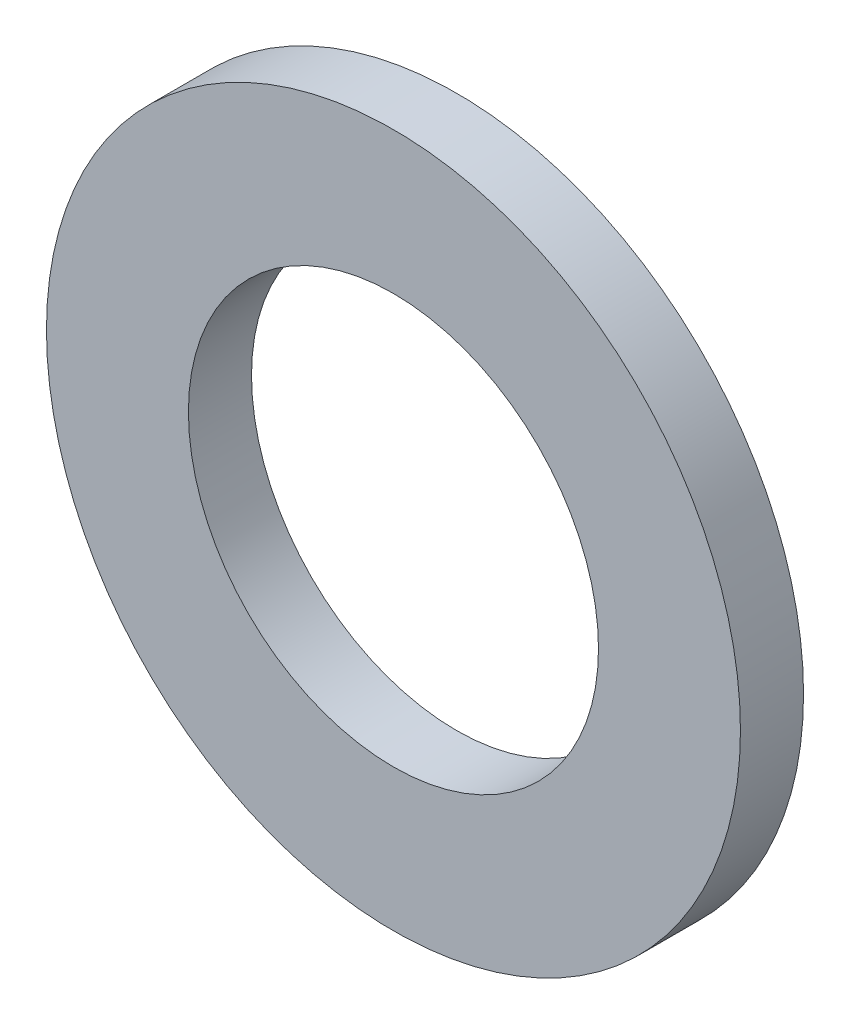
ISO-10303-21;
HEADER;
FILE_DESCRIPTION(('STEP AP214'),'2;1');
FILE_NAME('part.step','',(''),(''),'','','');
FILE_SCHEMA(('AUTOMOTIVE_DESIGN { 1 0 10303 214 1 1 1 1 }'));
ENDSEC;
DATA;
#1=APPLICATION_CONTEXT('core data for automotive mechanical design processes');
#2=APPLICATION_PROTOCOL_DEFINITION('international standard','automotive_design',2000,#1);
#3=PRODUCT_CONTEXT('',#1,'mechanical');
#4=PRODUCT('Part','Part','',(#3));
#5=PRODUCT_RELATED_PRODUCT_CATEGORY('part','',(#4));
#6=PRODUCT_DEFINITION_FORMATION('','',#4);
#7=PRODUCT_DEFINITION_CONTEXT('part definition',#1,'design');
#8=PRODUCT_DEFINITION('design','',#6,#7);
#9=PRODUCT_DEFINITION_SHAPE('','',#8);
#10=(LENGTH_UNIT() NAMED_UNIT(*) SI_UNIT(.MILLI.,.METRE.));
#11=(NAMED_UNIT(*) PLANE_ANGLE_UNIT() SI_UNIT($,.RADIAN.));
#12=(NAMED_UNIT(*) SI_UNIT($,.STERADIAN.) SOLID_ANGLE_UNIT());
#13=UNCERTAINTY_MEASURE_WITH_UNIT(LENGTH_MEASURE(1.E-05),#10,'distance_accuracy_value','');
#14=(GEOMETRIC_REPRESENTATION_CONTEXT(3) GLOBAL_UNCERTAINTY_ASSIGNED_CONTEXT((#13)) GLOBAL_UNIT_ASSIGNED_CONTEXT((#10,
#11,#12)) REPRESENTATION_CONTEXT('',''));
#15=CARTESIAN_POINT('',(0.,0.,0.));
#16=DIRECTION('',(0.,0.,1.));
#17=DIRECTION('',(1.,0.,0.));
#18=AXIS2_PLACEMENT_3D('',#15,#16,#17);
#19=CARTESIAN_POINT('',(0.,0.,4.));
#20=DIRECTION('',(0.,0.,-1.));
#21=DIRECTION('',(-1.,0.,0.));
#22=AXIS2_PLACEMENT_3D('',#19,#20,#21);
#23=CYLINDRICAL_SURFACE('',#22,13.);
#24=CARTESIAN_POINT('',(0.,0.,4.));
#25=DIRECTION('',(0.,0.,1.));
#26=DIRECTION('',(1.,0.,0.));
#27=AXIS2_PLACEMENT_3D('',#24,#25,#26);
#28=CIRCLE('',#27,13.);
#29=CARTESIAN_POINT('',(13.,0.,4.));
#30=VERTEX_POINT('',#29);
#31=EDGE_CURVE('E47',#30,#30,#28,.T.);
#32=ORIENTED_EDGE('',*,*,#31,.T.);
#33=EDGE_LOOP('',(#32));
#34=FACE_BOUND('',#33,.T.);
#35=CARTESIAN_POINT('',(0.,0.,0.));
#36=DIRECTION('',(0.,0.,1.));
#37=DIRECTION('',(1.,0.,0.));
#38=AXIS2_PLACEMENT_3D('',#35,#36,#37);
#39=CIRCLE('',#38,13.);
#40=CARTESIAN_POINT('',(13.,0.,0.));
#41=VERTEX_POINT('',#40);
#42=EDGE_CURVE('E54',#41,#41,#39,.T.);
#43=ORIENTED_EDGE('',*,*,#42,.F.);
#44=EDGE_LOOP('',(#43));
#45=FACE_BOUND('',#44,.T.);
#46=ADVANCED_FACE('F39',(#34,#45),#23,.F.);
#47=CARTESIAN_POINT('',(0.,0.,4.));
#48=DIRECTION('',(0.,0.,-1.));
#49=DIRECTION('',(-1.,0.,0.));
#50=AXIS2_PLACEMENT_3D('',#47,#48,#49);
#51=CYLINDRICAL_SURFACE('',#50,22.);
#52=CARTESIAN_POINT('',(0.,0.,4.));
#53=DIRECTION('',(0.,0.,1.));
#54=DIRECTION('',(1.,0.,0.));
#55=AXIS2_PLACEMENT_3D('',#52,#53,#54);
#56=CIRCLE('',#55,22.);
#57=CARTESIAN_POINT('',(22.,0.,4.));
#58=VERTEX_POINT('',#57);
#59=EDGE_CURVE('E10',#58,#58,#56,.T.);
#60=ORIENTED_EDGE('',*,*,#59,.F.);
#61=EDGE_LOOP('',(#60));
#62=FACE_BOUND('',#61,.T.);
#63=CARTESIAN_POINT('',(0.,0.,0.));
#64=DIRECTION('',(0.,0.,1.));
#65=DIRECTION('',(1.,0.,0.));
#66=AXIS2_PLACEMENT_3D('',#63,#64,#65);
#67=CIRCLE('',#66,22.);
#68=CARTESIAN_POINT('',(22.,0.,0.));
#69=VERTEX_POINT('',#68);
#70=EDGE_CURVE('E42',#69,#69,#67,.T.);
#71=ORIENTED_EDGE('',*,*,#70,.T.);
#72=EDGE_LOOP('',(#71));
#73=FACE_BOUND('',#72,.T.);
#74=ADVANCED_FACE('F63',(#62,#73),#51,.T.);
#75=CARTESIAN_POINT('',(0.,0.,4.));
#76=DIRECTION('',(0.,0.,1.));
#77=DIRECTION('',(1.,0.,0.));
#78=AXIS2_PLACEMENT_3D('',#75,#76,#77);
#79=PLANE('',#78);
#80=ORIENTED_EDGE('',*,*,#31,.F.);
#81=EDGE_LOOP('',(#80));
#82=FACE_BOUND('',#81,.T.);
#83=ORIENTED_EDGE('',*,*,#59,.T.);
#84=EDGE_LOOP('',(#83));
#85=FACE_BOUND('',#84,.T.);
#86=ADVANCED_FACE('F67',(#82,#85),#79,.T.);
#87=CARTESIAN_POINT('',(0.,0.,0.));
#88=DIRECTION('',(0.,0.,1.));
#89=DIRECTION('',(1.,0.,0.));
#90=AXIS2_PLACEMENT_3D('',#87,#88,#89);
#91=PLANE('',#90);
#92=ORIENTED_EDGE('',*,*,#42,.T.);
#93=EDGE_LOOP('',(#92));
#94=FACE_BOUND('',#93,.T.);
#95=ORIENTED_EDGE('',*,*,#70,.F.);
#96=EDGE_LOOP('',(#95));
#97=FACE_BOUND('',#96,.T.);
#98=ADVANCED_FACE('F65',(#94,#97),#91,.F.);
#99=CLOSED_SHELL('',(#46,#74,#86,#98));
#100=MANIFOLD_SOLID_BREP('B2',#99);
#101=ADVANCED_BREP_SHAPE_REPRESENTATION('',(#18,#100),#14);
#102=SHAPE_DEFINITION_REPRESENTATION(#9,#101);
ENDSEC;
END-ISO-10303-21;
